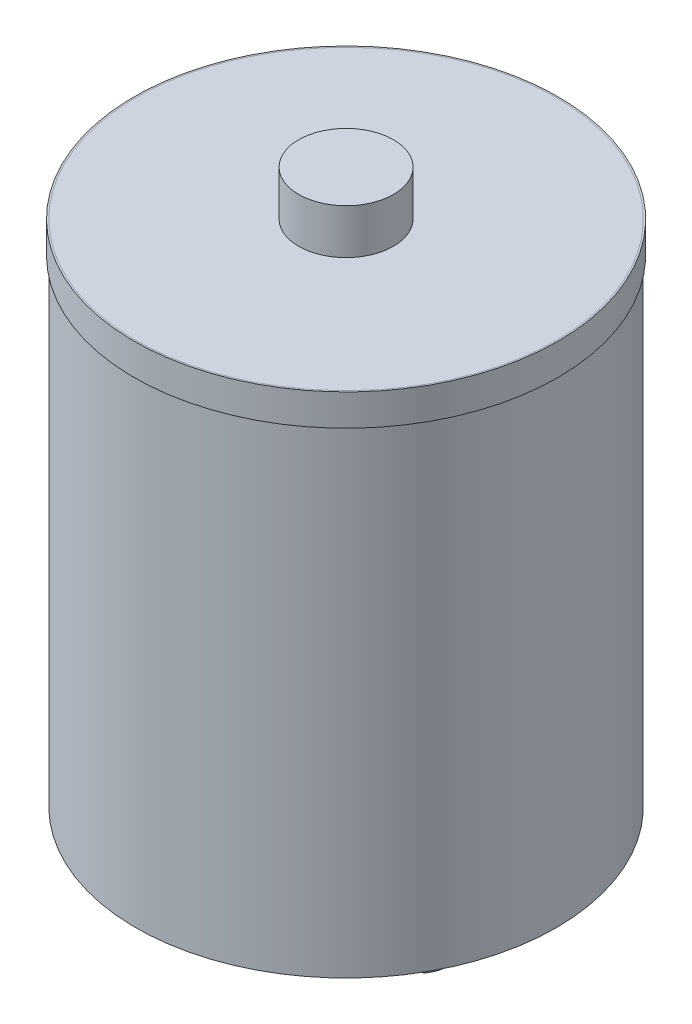
ISO-10303-21;
HEADER;
FILE_DESCRIPTION(('STEP AP214'),'2;1');
FILE_NAME('part.step','',(''),(''),'','','');
FILE_SCHEMA(('AUTOMOTIVE_DESIGN { 1 0 10303 214 1 1 1 1 }'));
ENDSEC;
DATA;
#1=APPLICATION_CONTEXT('core data for automotive mechanical design processes');
#2=APPLICATION_PROTOCOL_DEFINITION('international standard','automotive_design',2000,#1);
#3=PRODUCT_CONTEXT('',#1,'mechanical');
#4=PRODUCT('Part','Part','',(#3));
#5=PRODUCT_RELATED_PRODUCT_CATEGORY('part','',(#4));
#6=PRODUCT_DEFINITION_FORMATION('','',#4);
#7=PRODUCT_DEFINITION_CONTEXT('part definition',#1,'design');
#8=PRODUCT_DEFINITION('design','',#6,#7);
#9=PRODUCT_DEFINITION_SHAPE('','',#8);
#10=(LENGTH_UNIT() NAMED_UNIT(*) SI_UNIT(.MILLI.,.METRE.));
#11=(NAMED_UNIT(*) PLANE_ANGLE_UNIT() SI_UNIT($,.RADIAN.));
#12=(NAMED_UNIT(*) SI_UNIT($,.STERADIAN.) SOLID_ANGLE_UNIT());
#13=UNCERTAINTY_MEASURE_WITH_UNIT(LENGTH_MEASURE(1.E-05),#10,'distance_accuracy_value','');
#14=(GEOMETRIC_REPRESENTATION_CONTEXT(3) GLOBAL_UNCERTAINTY_ASSIGNED_CONTEXT((#13)) GLOBAL_UNIT_ASSIGNED_CONTEXT((#10,
#11,#12)) REPRESENTATION_CONTEXT('',''));
#15=CARTESIAN_POINT('',(0.,0.,0.));
#16=DIRECTION('',(0.,0.,1.));
#17=DIRECTION('',(1.,0.,0.));
#18=AXIS2_PLACEMENT_3D('',#15,#16,#17);
#19=CARTESIAN_POINT('',(0.,-32.6295,-5.741760236899));
#20=DIRECTION('',(0.,1.,0.));
#21=DIRECTION('',(0.,0.,-1.));
#22=AXIS2_PLACEMENT_3D('',#19,#20,#21);
#23=PLANE('',#22);
#24=CARTESIAN_POINT('',(0.,-32.6295,-5.6426));
#25=DIRECTION('',(0.,-1.,0.));
#26=DIRECTION('',(1.,0.,0.));
#27=AXIS2_PLACEMENT_3D('',#24,#25,#26);
#28=CIRCLE('',#27,2.5);
#29=CARTESIAN_POINT('',(-2.,-32.6295,-4.1426));
#30=VERTEX_POINT('',#29);
#31=CARTESIAN_POINT('',(2.,-32.6295,-4.1426));
#32=VERTEX_POINT('',#31);
#33=EDGE_CURVE('E206',#30,#32,#28,.T.);
#34=ORIENTED_EDGE('',*,*,#33,.T.);
#35=DIRECTION('',(1.,0.,0.));
#36=VECTOR('',#35,1.);
#37=CARTESIAN_POINT('',(-2.,-32.6295,-4.1426));
#38=LINE('',#37,#36);
#39=EDGE_CURVE('E10',#30,#32,#38,.T.);
#40=ORIENTED_EDGE('',*,*,#39,.F.);
#41=EDGE_LOOP('',(#34,#40));
#42=FACE_BOUND('',#41,.T.);
#43=ADVANCED_FACE('F17',(#42),#23,.F.);
#44=CARTESIAN_POINT('',(-2.,-20.1295,-4.1426));
#45=DIRECTION('',(0.,0.,1.));
#46=DIRECTION('',(0.,-1.,0.));
#47=AXIS2_PLACEMENT_3D('',#44,#45,#46);
#48=PLANE('',#47);
#49=DIRECTION('',(1.,0.,0.));
#50=VECTOR('',#49,1.);
#51=CARTESIAN_POINT('',(-2.,-22.6295,-4.1426));
#52=LINE('',#51,#50);
#53=CARTESIAN_POINT('',(-2.,-22.6295,-4.1426));
#54=VERTEX_POINT('',#53);
#55=CARTESIAN_POINT('',(2.,-22.6295,-4.1426));
#56=VERTEX_POINT('',#55);
#57=EDGE_CURVE('E136',#54,#56,#52,.T.);
#58=ORIENTED_EDGE('',*,*,#57,.F.);
#59=DIRECTION('',(0.,-1.,0.));
#60=VECTOR('',#59,1.);
#61=CARTESIAN_POINT('',(-2.,-20.1295,-4.1426));
#62=LINE('',#61,#60);
#63=EDGE_CURVE('E20',#54,#30,#62,.T.);
#64=ORIENTED_EDGE('',*,*,#63,.T.);
#65=ORIENTED_EDGE('',*,*,#39,.T.);
#66=DIRECTION('',(0.,-1.,0.));
#67=VECTOR('',#66,1.);
#68=CARTESIAN_POINT('',(2.,-20.1295,-4.1426));
#69=LINE('',#68,#67);
#70=EDGE_CURVE('E203',#56,#32,#69,.T.);
#71=ORIENTED_EDGE('',*,*,#70,.F.);
#72=EDGE_LOOP('',(#58,#64,#65,#71));
#73=FACE_BOUND('',#72,.T.);
#74=ADVANCED_FACE('F215',(#73),#48,.T.);
#75=CARTESIAN_POINT('',(0.,-20.1295,-5.6426));
#76=DIRECTION('',(0.,1.,0.));
#77=DIRECTION('',(1.,0.,0.));
#78=AXIS2_PLACEMENT_3D('',#75,#76,#77);
#79=CYLINDRICAL_SURFACE('',#78,2.5);
#80=ORIENTED_EDGE('',*,*,#70,.T.);
#81=ORIENTED_EDGE('',*,*,#33,.F.);
#82=ORIENTED_EDGE('',*,*,#63,.F.);
#83=CARTESIAN_POINT('',(0.,-22.6295,-5.6426));
#84=DIRECTION('',(0.,-1.,0.));
#85=DIRECTION('',(1.,0.,0.));
#86=AXIS2_PLACEMENT_3D('',#83,#84,#85);
#87=CIRCLE('',#86,2.5);
#88=EDGE_CURVE('E196',#54,#56,#87,.T.);
#89=ORIENTED_EDGE('',*,*,#88,.T.);
#90=EDGE_LOOP('',(#80,#81,#82,#89));
#91=FACE_BOUND('',#90,.T.);
#92=ADVANCED_FACE('F218',(#91),#79,.T.);
#93=CARTESIAN_POINT('',(11.809988431408,-10.1295,-6.8185));
#94=DIRECTION('',(0.,-1.,0.));
#95=DIRECTION('',(1.,0.,0.));
#96=AXIS2_PLACEMENT_3D('',#93,#94,#95);
#97=CONICAL_SURFACE('',#96,1.25,1.029744258677);
#98=CARTESIAN_POINT('',(11.809988431408,-10.1295,-6.8185));
#99=DIRECTION('',(0.,-1.,0.));
#100=DIRECTION('',(1.,0.,0.));
#101=AXIS2_PLACEMENT_3D('',#98,#99,#100);
#102=CIRCLE('',#101,1.25);
#103=CARTESIAN_POINT('',(13.059988431408,-10.1295,-6.8185));
#104=VERTEX_POINT('',#103);
#105=EDGE_CURVE('E129',#104,#104,#102,.T.);
#106=ORIENTED_EDGE('',*,*,#105,.T.);
#107=DIRECTION('',(-0.857167300702106,0.515038074910064,0.));
#108=VECTOR('',#107,1.);
#109=CARTESIAN_POINT('',(13.059988431408,-10.1295,-6.8185));
#110=LINE('',#109,#108);
#111=CARTESIAN_POINT('',(11.809988431408,-9.378424226216,-6.8185));
#112=VERTEX_POINT('',#111);
#113=EDGE_CURVE('E200',#104,#112,#110,.T.);
#114=ORIENTED_EDGE('',*,*,#113,.T.);
#115=ORIENTED_EDGE('',*,*,#113,.F.);
#116=EDGE_LOOP('',(#106,#114,#115));
#117=FACE_BOUND('',#116,.T.);
#118=ADVANCED_FACE('F224',(#117),#97,.F.);
#119=CARTESIAN_POINT('',(0.,-22.6295,-5.677472716439));
#120=DIRECTION('',(0.,1.,0.));
#121=DIRECTION('',(0.,0.,-1.));
#122=AXIS2_PLACEMENT_3D('',#119,#120,#121);
#123=PLANE('',#122);
#124=ORIENTED_EDGE('',*,*,#57,.T.);
#125=ORIENTED_EDGE('',*,*,#88,.F.);
#126=EDGE_LOOP('',(#124,#125));
#127=FACE_BOUND('',#126,.T.);
#128=CARTESIAN_POINT('',(0.,-22.6295,-5.6426));
#129=DIRECTION('',(0.,-1.,0.));
#130=DIRECTION('',(1.,0.,0.));
#131=AXIS2_PLACEMENT_3D('',#128,#129,#130);
#132=CIRCLE('',#131,5.);
#133=CARTESIAN_POINT('',(5.,-22.6295,-5.6426));
#134=VERTEX_POINT('',#133);
#135=EDGE_CURVE('E187',#134,#134,#132,.T.);
#136=ORIENTED_EDGE('',*,*,#135,.T.);
#137=EDGE_LOOP('',(#136));
#138=FACE_BOUND('',#137,.T.);
#139=ADVANCED_FACE('F220',(#127,#138),#123,.F.);
#140=CARTESIAN_POINT('',(0.,-10.1295,13.637));
#141=DIRECTION('',(0.,-1.,0.));
#142=DIRECTION('',(1.,0.,0.));
#143=AXIS2_PLACEMENT_3D('',#140,#141,#142);
#144=CONICAL_SURFACE('',#143,1.25,1.029744258677);
#145=CARTESIAN_POINT('',(0.,-10.1295,13.637));
#146=DIRECTION('',(0.,-1.,0.));
#147=DIRECTION('',(1.,0.,0.));
#148=AXIS2_PLACEMENT_3D('',#145,#146,#147);
#149=CIRCLE('',#148,1.25);
#150=CARTESIAN_POINT('',(1.25,-10.1295,13.637));
#151=VERTEX_POINT('',#150);
#152=EDGE_CURVE('E179',#151,#151,#149,.T.);
#153=ORIENTED_EDGE('',*,*,#152,.T.);
#154=DIRECTION('',(-0.857167300702106,0.515038074910064,0.));
#155=VECTOR('',#154,1.);
#156=CARTESIAN_POINT('',(1.25,-10.1295,13.637));
#157=LINE('',#156,#155);
#158=CARTESIAN_POINT('',(0.,-9.378424226216,13.637));
#159=VERTEX_POINT('',#158);
#160=EDGE_CURVE('E128',#151,#159,#157,.T.);
#161=ORIENTED_EDGE('',*,*,#160,.T.);
#162=ORIENTED_EDGE('',*,*,#160,.F.);
#163=EDGE_LOOP('',(#153,#161,#162));
#164=FACE_BOUND('',#163,.T.);
#165=ADVANCED_FACE('F223',(#164),#144,.F.);
#166=CARTESIAN_POINT('',(-11.8099884314,-10.1295,-6.8185));
#167=DIRECTION('',(0.,-1.,0.));
#168=DIRECTION('',(1.,0.,0.));
#169=AXIS2_PLACEMENT_3D('',#166,#167,#168);
#170=CONICAL_SURFACE('',#169,1.25,1.029744258677);
#171=CARTESIAN_POINT('',(-11.8099884314,-10.1295,-6.8185));
#172=DIRECTION('',(0.,-1.,0.));
#173=DIRECTION('',(1.,0.,0.));
#174=AXIS2_PLACEMENT_3D('',#171,#172,#173);
#175=CIRCLE('',#174,1.25);
#176=CARTESIAN_POINT('',(-10.5599884314,-10.1295,-6.8185));
#177=VERTEX_POINT('',#176);
#178=EDGE_CURVE('E126',#177,#177,#175,.T.);
#179=ORIENTED_EDGE('',*,*,#178,.T.);
#180=DIRECTION('',(-0.857167300702106,0.515038074910064,0.));
#181=VECTOR('',#180,1.);
#182=CARTESIAN_POINT('',(-10.5599884314,-10.1295,-6.8185));
#183=LINE('',#182,#181);
#184=CARTESIAN_POINT('',(-11.8099884314,-9.378424226216,-6.8185));
#185=VERTEX_POINT('',#184);
#186=EDGE_CURVE('E123',#177,#185,#183,.T.);
#187=ORIENTED_EDGE('',*,*,#186,.T.);
#188=ORIENTED_EDGE('',*,*,#186,.F.);
#189=EDGE_LOOP('',(#179,#187,#188));
#190=FACE_BOUND('',#189,.T.);
#191=ADVANCED_FACE('F124',(#190),#170,.F.);
#192=CARTESIAN_POINT('',(11.809988431408,-20.1295,-6.8185));
#193=DIRECTION('',(0.,1.,0.));
#194=DIRECTION('',(1.,0.,0.));
#195=AXIS2_PLACEMENT_3D('',#192,#193,#194);
#196=CYLINDRICAL_SURFACE('',#195,1.25);
#197=DIRECTION('',(0.,1.,0.));
#198=VECTOR('',#197,1.);
#199=CARTESIAN_POINT('',(13.059988431408,-20.1295,-6.8185));
#200=LINE('',#199,#198);
#201=CARTESIAN_POINT('',(13.059988431408,-20.1295,-6.8185));
#202=VERTEX_POINT('',#201);
#203=EDGE_CURVE('E139',#202,#104,#200,.T.);
#204=ORIENTED_EDGE('',*,*,#203,.F.);
#205=CARTESIAN_POINT('',(11.809988431408,-20.1295,-6.8185));
#206=DIRECTION('',(0.,-1.,0.));
#207=DIRECTION('',(1.,0.,0.));
#208=AXIS2_PLACEMENT_3D('',#205,#206,#207);
#209=CIRCLE('',#208,1.25);
#210=EDGE_CURVE('E170',#202,#202,#209,.T.);
#211=ORIENTED_EDGE('',*,*,#210,.T.);
#212=ORIENTED_EDGE('',*,*,#203,.T.);
#213=ORIENTED_EDGE('',*,*,#105,.F.);
#214=EDGE_LOOP('',(#204,#211,#212,#213));
#215=FACE_BOUND('',#214,.T.);
#216=ADVANCED_FACE('F269',(#215),#196,.F.);
#217=CARTESIAN_POINT('',(0.,-20.1295,-5.6426));
#218=DIRECTION('',(0.,1.,0.));
#219=DIRECTION('',(1.,0.,0.));
#220=AXIS2_PLACEMENT_3D('',#217,#218,#219);
#221=CYLINDRICAL_SURFACE('',#220,5.);
#222=CARTESIAN_POINT('',(0.,-20.1295,-5.6426));
#223=DIRECTION('',(0.,-1.,0.));
#224=DIRECTION('',(1.,0.,0.));
#225=AXIS2_PLACEMENT_3D('',#222,#223,#224);
#226=CIRCLE('',#225,5.);
#227=CARTESIAN_POINT('',(5.,-20.1295,-5.6426));
#228=VERTEX_POINT('',#227);
#229=EDGE_CURVE('E158',#228,#228,#226,.T.);
#230=ORIENTED_EDGE('',*,*,#229,.T.);
#231=DIRECTION('',(0.,-1.,0.));
#232=VECTOR('',#231,1.);
#233=CARTESIAN_POINT('',(5.,-20.1295,-5.6426));
#234=LINE('',#233,#232);
#235=EDGE_CURVE('E183',#228,#134,#234,.T.);
#236=ORIENTED_EDGE('',*,*,#235,.T.);
#237=ORIENTED_EDGE('',*,*,#135,.F.);
#238=ORIENTED_EDGE('',*,*,#235,.F.);
#239=EDGE_LOOP('',(#230,#236,#237,#238));
#240=FACE_BOUND('',#239,.T.);
#241=ADVANCED_FACE('F228',(#240),#221,.T.);
#242=CARTESIAN_POINT('',(0.,-20.1295,13.637));
#243=DIRECTION('',(0.,1.,0.));
#244=DIRECTION('',(1.,0.,0.));
#245=AXIS2_PLACEMENT_3D('',#242,#243,#244);
#246=CYLINDRICAL_SURFACE('',#245,1.25);
#247=DIRECTION('',(0.,1.,0.));
#248=VECTOR('',#247,1.);
#249=CARTESIAN_POINT('',(1.25,-20.1295,13.637));
#250=LINE('',#249,#248);
#251=CARTESIAN_POINT('',(1.25,-20.1295,13.637));
#252=VERTEX_POINT('',#251);
#253=EDGE_CURVE('E175',#252,#151,#250,.T.);
#254=ORIENTED_EDGE('',*,*,#253,.F.);
#255=CARTESIAN_POINT('',(0.,-20.1295,13.637));
#256=DIRECTION('',(0.,-1.,0.));
#257=DIRECTION('',(1.,0.,0.));
#258=AXIS2_PLACEMENT_3D('',#255,#256,#257);
#259=CIRCLE('',#258,1.25);
#260=EDGE_CURVE('E155',#252,#252,#259,.T.);
#261=ORIENTED_EDGE('',*,*,#260,.T.);
#262=ORIENTED_EDGE('',*,*,#253,.T.);
#263=ORIENTED_EDGE('',*,*,#152,.F.);
#264=EDGE_LOOP('',(#254,#261,#262,#263));
#265=FACE_BOUND('',#264,.T.);
#266=ADVANCED_FACE('F294',(#265),#246,.F.);
#267=CARTESIAN_POINT('',(-11.8099884314,-20.1295,-6.8185));
#268=DIRECTION('',(0.,1.,0.));
#269=DIRECTION('',(1.,0.,0.));
#270=AXIS2_PLACEMENT_3D('',#267,#268,#269);
#271=CYLINDRICAL_SURFACE('',#270,1.25);
#272=DIRECTION('',(0.,1.,0.));
#273=VECTOR('',#272,1.);
#274=CARTESIAN_POINT('',(-10.5599884314,-20.1295,-6.8185));
#275=LINE('',#274,#273);
#276=CARTESIAN_POINT('',(-10.5599884314,-20.1295,-6.8185));
#277=VERTEX_POINT('',#276);
#278=EDGE_CURVE('E171',#277,#177,#275,.T.);
#279=ORIENTED_EDGE('',*,*,#278,.F.);
#280=CARTESIAN_POINT('',(-11.8099884314,-20.1295,-6.8185));
#281=DIRECTION('',(0.,-1.,0.));
#282=DIRECTION('',(1.,0.,0.));
#283=AXIS2_PLACEMENT_3D('',#280,#281,#282);
#284=CIRCLE('',#283,1.25);
#285=EDGE_CURVE('E159',#277,#277,#284,.T.);
#286=ORIENTED_EDGE('',*,*,#285,.T.);
#287=ORIENTED_EDGE('',*,*,#278,.T.);
#288=ORIENTED_EDGE('',*,*,#178,.F.);
#289=EDGE_LOOP('',(#279,#286,#287,#288));
#290=FACE_BOUND('',#289,.T.);
#291=ADVANCED_FACE('F235',(#290),#271,.F.);
#292=CARTESIAN_POINT('',(0.,-20.1295,0.));
#293=DIRECTION('',(0.,1.,0.));
#294=DIRECTION('',(0.,0.,-1.));
#295=AXIS2_PLACEMENT_3D('',#292,#293,#294);
#296=PLANE('',#295);
#297=ORIENTED_EDGE('',*,*,#210,.F.);
#298=EDGE_LOOP('',(#297));
#299=FACE_BOUND('',#298,.T.);
#300=ORIENTED_EDGE('',*,*,#229,.F.);
#301=EDGE_LOOP('',(#300));
#302=FACE_BOUND('',#301,.T.);
#303=ORIENTED_EDGE('',*,*,#260,.F.);
#304=EDGE_LOOP('',(#303));
#305=FACE_BOUND('',#304,.T.);
#306=ORIENTED_EDGE('',*,*,#285,.F.);
#307=EDGE_LOOP('',(#306));
#308=FACE_BOUND('',#307,.T.);
#309=CARTESIAN_POINT('',(0.,-20.1295,0.));
#310=DIRECTION('',(0.,-1.,0.));
#311=DIRECTION('',(1.,0.,0.));
#312=AXIS2_PLACEMENT_3D('',#309,#310,#311);
#313=CIRCLE('',#312,16.637);
#314=CARTESIAN_POINT('',(16.637,-20.1295,0.));
#315=VERTEX_POINT('',#314);
#316=EDGE_CURVE('E161',#315,#315,#313,.T.);
#317=ORIENTED_EDGE('',*,*,#316,.T.);
#318=EDGE_LOOP('',(#317));
#319=FACE_BOUND('',#318,.T.);
#320=ADVANCED_FACE('F231',(#299,#302,#305,#308,#319),#296,.F.);
#321=CARTESIAN_POINT('',(0.,20.1295,0.));
#322=DIRECTION('',(0.,1.,0.));
#323=DIRECTION('',(1.,0.,0.));
#324=AXIS2_PLACEMENT_3D('',#321,#322,#323);
#325=CYLINDRICAL_SURFACE('',#324,16.637);
#326=DIRECTION('',(0.,-1.,0.));
#327=VECTOR('',#326,1.);
#328=CARTESIAN_POINT('',(16.637,20.1295,0.));
#329=LINE('',#328,#327);
#330=CARTESIAN_POINT('',(16.637,17.6403,0.));
#331=VERTEX_POINT('',#330);
#332=EDGE_CURVE('E154',#331,#315,#329,.T.);
#333=ORIENTED_EDGE('',*,*,#332,.T.);
#334=ORIENTED_EDGE('',*,*,#316,.F.);
#335=ORIENTED_EDGE('',*,*,#332,.F.);
#336=CARTESIAN_POINT('',(0.,17.6403,0.));
#337=DIRECTION('',(0.,1.,0.));
#338=DIRECTION('',(1.,0.,0.));
#339=AXIS2_PLACEMENT_3D('',#336,#337,#338);
#340=CIRCLE('',#339,16.637);
#341=EDGE_CURVE('E150',#331,#331,#340,.T.);
#342=ORIENTED_EDGE('',*,*,#341,.F.);
#343=EDGE_LOOP('',(#333,#334,#335,#342));
#344=FACE_BOUND('',#343,.T.);
#345=ADVANCED_FACE('F234',(#344),#325,.T.);
#346=CARTESIAN_POINT('',(0.,17.6403,0.));
#347=DIRECTION('',(0.,1.,0.));
#348=DIRECTION('',(0.,0.,-1.));
#349=AXIS2_PLACEMENT_3D('',#346,#347,#348);
#350=PLANE('',#349);
#351=ORIENTED_EDGE('',*,*,#341,.T.);
#352=EDGE_LOOP('',(#351));
#353=FACE_BOUND('',#352,.T.);
#354=CARTESIAN_POINT('',(0.,17.6403,0.));
#355=DIRECTION('',(0.,1.,0.));
#356=DIRECTION('',(1.,0.,0.));
#357=AXIS2_PLACEMENT_3D('',#354,#355,#356);
#358=CIRCLE('',#357,16.764);
#359=CARTESIAN_POINT('',(16.764,17.6403,0.));
#360=VERTEX_POINT('',#359);
#361=EDGE_CURVE('E149',#360,#360,#358,.T.);
#362=ORIENTED_EDGE('',*,*,#361,.F.);
#363=EDGE_LOOP('',(#362));
#364=FACE_BOUND('',#363,.T.);
#365=ADVANCED_FACE('F307',(#353,#364),#350,.F.);
#366=CARTESIAN_POINT('',(0.,23.6855,0.));
#367=DIRECTION('',(0.,1.,0.));
#368=DIRECTION('',(0.,0.,-1.));
#369=AXIS2_PLACEMENT_3D('',#366,#367,#368);
#370=PLANE('',#369);
#371=CARTESIAN_POINT('',(0.,23.6855,0.));
#372=DIRECTION('',(0.,1.,0.));
#373=DIRECTION('',(1.,0.,0.));
#374=AXIS2_PLACEMENT_3D('',#371,#372,#373);
#375=CIRCLE('',#374,3.75);
#376=CARTESIAN_POINT('',(3.75,23.6855,0.));
#377=VERTEX_POINT('',#376);
#378=EDGE_CURVE('E143',#377,#377,#375,.T.);
#379=ORIENTED_EDGE('',*,*,#378,.T.);
#380=EDGE_LOOP('',(#379));
#381=FACE_BOUND('',#380,.T.);
#382=ADVANCED_FACE('F309',(#381),#370,.T.);
#383=CARTESIAN_POINT('',(0.,20.1295,0.));
#384=DIRECTION('',(0.,1.,0.));
#385=DIRECTION('',(1.,0.,0.));
#386=AXIS2_PLACEMENT_3D('',#383,#384,#385);
#387=CYLINDRICAL_SURFACE('',#386,16.764);
#388=DIRECTION('',(0.,-1.,0.));
#389=VECTOR('',#388,1.);
#390=CARTESIAN_POINT('',(16.764,20.1295,0.));
#391=LINE('',#390,#389);
#392=CARTESIAN_POINT('',(16.764,20.1295,0.));
#393=VERTEX_POINT('',#392);
#394=EDGE_CURVE('E145',#393,#360,#391,.T.);
#395=ORIENTED_EDGE('',*,*,#394,.T.);
#396=ORIENTED_EDGE('',*,*,#361,.T.);
#397=ORIENTED_EDGE('',*,*,#394,.F.);
#398=CARTESIAN_POINT('',(0.,20.1295,0.));
#399=DIRECTION('',(0.,1.,0.));
#400=DIRECTION('',(1.,0.,0.));
#401=AXIS2_PLACEMENT_3D('',#398,#399,#400);
#402=CIRCLE('',#401,16.764);
#403=EDGE_CURVE('E256',#393,#393,#402,.T.);
#404=ORIENTED_EDGE('',*,*,#403,.F.);
#405=EDGE_LOOP('',(#395,#396,#397,#404));
#406=FACE_BOUND('',#405,.T.);
#407=ADVANCED_FACE('F312',(#406),#387,.T.);
#408=CARTESIAN_POINT('',(0.,20.1295,0.));
#409=DIRECTION('',(0.,-1.,0.));
#410=DIRECTION('',(1.,0.,0.));
#411=AXIS2_PLACEMENT_3D('',#408,#409,#410);
#412=CYLINDRICAL_SURFACE('',#411,3.75);
#413=CARTESIAN_POINT('',(0.,20.1295,0.));
#414=DIRECTION('',(0.,1.,0.));
#415=DIRECTION('',(1.,0.,0.));
#416=AXIS2_PLACEMENT_3D('',#413,#414,#415);
#417=CIRCLE('',#416,3.75);
#418=CARTESIAN_POINT('',(3.75,20.1295,0.));
#419=VERTEX_POINT('',#418);
#420=EDGE_CURVE('E252',#419,#419,#417,.T.);
#421=ORIENTED_EDGE('',*,*,#420,.T.);
#422=DIRECTION('',(0.,1.,0.));
#423=VECTOR('',#422,1.);
#424=CARTESIAN_POINT('',(3.75,20.1295,0.));
#425=LINE('',#424,#423);
#426=EDGE_CURVE('E259',#419,#377,#425,.T.);
#427=ORIENTED_EDGE('',*,*,#426,.T.);
#428=ORIENTED_EDGE('',*,*,#378,.F.);
#429=ORIENTED_EDGE('',*,*,#426,.F.);
#430=EDGE_LOOP('',(#421,#427,#428,#429));
#431=FACE_BOUND('',#430,.T.);
#432=ADVANCED_FACE('F319',(#431),#412,.T.);
#433=CARTESIAN_POINT('',(0.,20.1295,0.));
#434=DIRECTION('',(0.,1.,0.));
#435=DIRECTION('',(0.,0.,-1.));
#436=AXIS2_PLACEMENT_3D('',#433,#434,#435);
#437=PLANE('',#436);
#438=CARTESIAN_POINT('',(0.,20.1295,0.));
#439=DIRECTION('',(0.,-1.,0.));
#440=DIRECTION('',(1.,0.,0.));
#441=AXIS2_PLACEMENT_3D('',#438,#439,#440);
#442=CIRCLE('',#441,16.637);
#443=CARTESIAN_POINT('',(16.637,20.1295,0.));
#444=VERTEX_POINT('',#443);
#445=EDGE_CURVE('E338',#444,#444,#442,.T.);
#446=ORIENTED_EDGE('',*,*,#445,.T.);
#447=EDGE_LOOP('',(#446));
#448=FACE_BOUND('',#447,.T.);
#449=ORIENTED_EDGE('',*,*,#403,.T.);
#450=EDGE_LOOP('',(#449));
#451=FACE_BOUND('',#450,.T.);
#452=ADVANCED_FACE('F323',(#448,#451),#437,.T.);
#453=CARTESIAN_POINT('',(0.,20.1295,0.));
#454=DIRECTION('',(0.,1.,0.));
#455=DIRECTION('',(0.,0.,-1.));
#456=AXIS2_PLACEMENT_3D('',#453,#454,#455);
#457=PLANE('',#456);
#458=ORIENTED_EDGE('',*,*,#420,.F.);
#459=EDGE_LOOP('',(#458));
#460=FACE_BOUND('',#459,.T.);
#461=ORIENTED_EDGE('',*,*,#445,.F.);
#462=EDGE_LOOP('',(#461));
#463=FACE_BOUND('',#462,.T.);
#464=ADVANCED_FACE('F327',(#460,#463),#457,.T.);
#465=CLOSED_SHELL('',(#43,#74,#92,#118,#139,#165,#191,#216,#241,#266,#291,#320,#345,#365,#382,
#407,#432,#452,#464));
#466=MANIFOLD_SOLID_BREP('B1',#465);
#467=ADVANCED_BREP_SHAPE_REPRESENTATION('',(#18,#466),#14);
#468=SHAPE_DEFINITION_REPRESENTATION(#9,#467);
ENDSEC;
END-ISO-10303-21;
